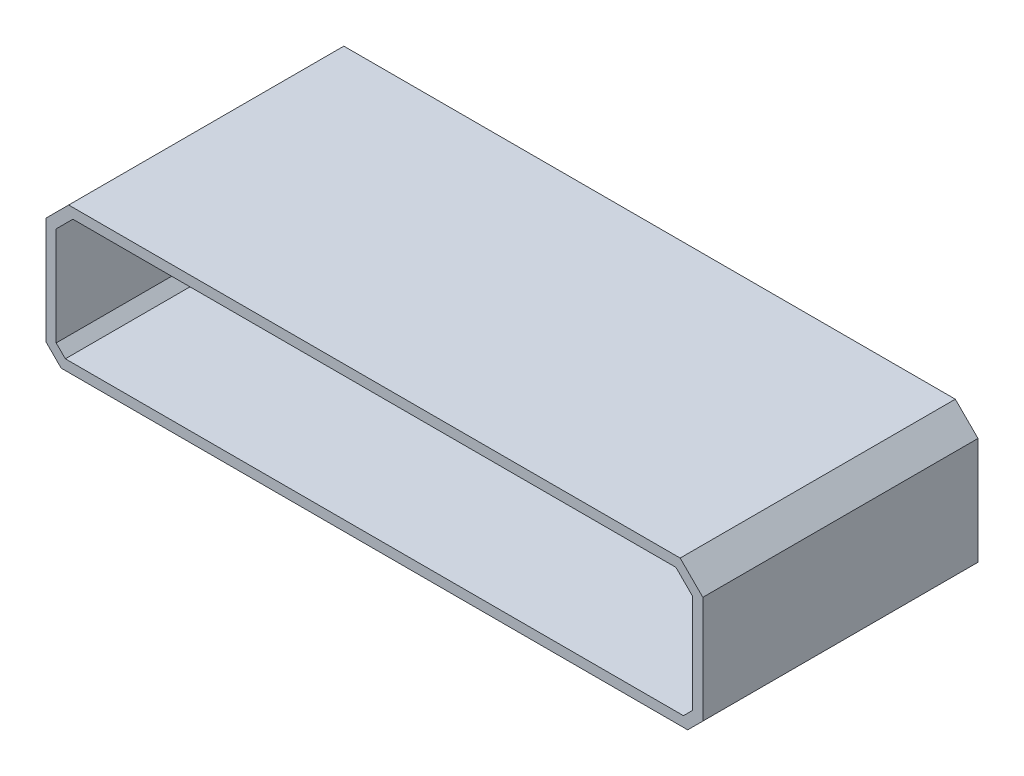
ISO-10303-21;
HEADER;
FILE_DESCRIPTION(('STEP AP214'),'2;1');
FILE_NAME('part.step','',(''),(''),'','','');
FILE_SCHEMA(('AUTOMOTIVE_DESIGN { 1 0 10303 214 1 1 1 1 }'));
ENDSEC;
DATA;
#1=APPLICATION_CONTEXT('core data for automotive mechanical design processes');
#2=APPLICATION_PROTOCOL_DEFINITION('international standard','automotive_design',2000,#1);
#3=PRODUCT_CONTEXT('',#1,'mechanical');
#4=PRODUCT('Part','Part','',(#3));
#5=PRODUCT_RELATED_PRODUCT_CATEGORY('part','',(#4));
#6=PRODUCT_DEFINITION_FORMATION('','',#4);
#7=PRODUCT_DEFINITION_CONTEXT('part definition',#1,'design');
#8=PRODUCT_DEFINITION('design','',#6,#7);
#9=PRODUCT_DEFINITION_SHAPE('','',#8);
#10=(LENGTH_UNIT() NAMED_UNIT(*) SI_UNIT(.MILLI.,.METRE.));
#11=(NAMED_UNIT(*) PLANE_ANGLE_UNIT() SI_UNIT($,.RADIAN.));
#12=(NAMED_UNIT(*) SI_UNIT($,.STERADIAN.) SOLID_ANGLE_UNIT());
#13=UNCERTAINTY_MEASURE_WITH_UNIT(LENGTH_MEASURE(1.E-05),#10,'distance_accuracy_value','');
#14=(GEOMETRIC_REPRESENTATION_CONTEXT(3) GLOBAL_UNCERTAINTY_ASSIGNED_CONTEXT((#13)) GLOBAL_UNIT_ASSIGNED_CONTEXT((#10,
#11,#12)) REPRESENTATION_CONTEXT('',''));
#15=CARTESIAN_POINT('',(0.,0.,0.));
#16=DIRECTION('',(0.,0.,1.));
#17=DIRECTION('',(1.,0.,0.));
#18=AXIS2_PLACEMENT_3D('',#15,#16,#17);
#19=CARTESIAN_POINT('',(0.,0.,685.8));
#20=DIRECTION('',(0.,0.,1.));
#21=DIRECTION('',(1.,0.,0.));
#22=AXIS2_PLACEMENT_3D('',#19,#20,#21);
#23=PLANE('',#22);
#24=DIRECTION('',(-0.707106781186546,-0.707106781186549,0.));
#25=VECTOR('',#24,1.);
#26=CARTESIAN_POINT('',(-762.,0.,685.8));
#27=LINE('',#26,#25);
#28=CARTESIAN_POINT('',(-762.,0.,685.8));
#29=VERTEX_POINT('',#28);
#30=CARTESIAN_POINT('',(-818.489894306675,-56.4898943066749,685.8));
#31=VERTEX_POINT('',#30);
#32=EDGE_CURVE('E215',#29,#31,#27,.T.);
#33=ORIENTED_EDGE('',*,*,#32,.T.);
#34=DIRECTION('',(0.,-1.,0.));
#35=VECTOR('',#34,1.);
#36=CARTESIAN_POINT('',(-818.489894306675,-56.4898943066749,685.8));
#37=LINE('',#36,#35);
#38=CARTESIAN_POINT('',(-818.489894306675,-323.748806026489,685.8));
#39=VERTEX_POINT('',#38);
#40=EDGE_CURVE('E218',#31,#39,#37,.T.);
#41=ORIENTED_EDGE('',*,*,#40,.T.);
#42=DIRECTION('',(0.707106781186548,-0.707106781186547,0.));
#43=VECTOR('',#42,1.);
#44=CARTESIAN_POINT('',(-818.489894306675,-323.748806026489,685.8));
#45=LINE('',#44,#43);
#46=CARTESIAN_POINT('',(-780.750847269863,-361.487853063301,685.8));
#47=VERTEX_POINT('',#46);
#48=EDGE_CURVE('E221',#39,#47,#45,.T.);
#49=ORIENTED_EDGE('',*,*,#48,.T.);
#50=DIRECTION('',(1.,0.,0.));
#51=VECTOR('',#50,1.);
#52=CARTESIAN_POINT('',(-780.750847269863,-361.487853063301,685.8));
#53=LINE('',#52,#51);
#54=CARTESIAN_POINT('',(780.750847269863,-361.487853063301,685.8));
#55=VERTEX_POINT('',#54);
#56=EDGE_CURVE('E223',#47,#55,#53,.T.);
#57=ORIENTED_EDGE('',*,*,#56,.T.);
#58=DIRECTION('',(0.707106781186549,0.707106781186546,0.));
#59=VECTOR('',#58,1.);
#60=CARTESIAN_POINT('',(818.489894306675,-323.748806026489,685.8));
#61=LINE('',#60,#59);
#62=CARTESIAN_POINT('',(818.489894306675,-323.748806026489,685.8));
#63=VERTEX_POINT('',#62);
#64=EDGE_CURVE('E225',#55,#63,#61,.T.);
#65=ORIENTED_EDGE('',*,*,#64,.T.);
#66=DIRECTION('',(0.,1.,0.));
#67=VECTOR('',#66,1.);
#68=CARTESIAN_POINT('',(818.489894306675,-56.4898943066747,685.8));
#69=LINE('',#68,#67);
#70=CARTESIAN_POINT('',(818.489894306675,-56.4898943066747,685.8));
#71=VERTEX_POINT('',#70);
#72=EDGE_CURVE('E227',#63,#71,#69,.T.);
#73=ORIENTED_EDGE('',*,*,#72,.T.);
#74=DIRECTION('',(-0.707106781186546,0.707106781186549,0.));
#75=VECTOR('',#74,1.);
#76=CARTESIAN_POINT('',(762.,2.09200255290344E-13,685.8));
#77=LINE('',#76,#75);
#78=CARTESIAN_POINT('',(762.,2.09200255290344E-13,685.8));
#79=VERTEX_POINT('',#78);
#80=EDGE_CURVE('E229',#71,#79,#77,.T.);
#81=ORIENTED_EDGE('',*,*,#80,.T.);
#82=DIRECTION('',(-1.,0.,0.));
#83=VECTOR('',#82,1.);
#84=CARTESIAN_POINT('',(762.,2.09200255290344E-13,685.8));
#85=LINE('',#84,#83);
#86=EDGE_CURVE('E231',#79,#29,#85,.T.);
#87=ORIENTED_EDGE('',*,*,#86,.T.);
#88=EDGE_LOOP('',(#33,#41,#49,#57,#65,#73,#81,#87));
#89=FACE_BOUND('',#88,.T.);
#90=DIRECTION('',(-1.,0.,0.));
#91=VECTOR('',#90,1.);
#92=CARTESIAN_POINT('',(751.478975515723,-25.3999999999998,685.8));
#93=LINE('',#92,#91);
#94=CARTESIAN_POINT('',(751.478975515723,-25.3999999999998,685.8));
#95=VERTEX_POINT('',#94);
#96=CARTESIAN_POINT('',(-751.478975515723,-25.3999999999998,685.8));
#97=VERTEX_POINT('',#96);
#98=EDGE_CURVE('E158',#95,#97,#93,.T.);
#99=ORIENTED_EDGE('',*,*,#98,.F.);
#100=DIRECTION('',(-0.707106781186547,0.707106781186548,0.));
#101=VECTOR('',#100,1.);
#102=CARTESIAN_POINT('',(751.478975515723,-25.3999999999998,685.8));
#103=LINE('',#102,#101);
#104=CARTESIAN_POINT('',(793.089894306675,-67.0109187909511,685.8));
#105=VERTEX_POINT('',#104);
#106=EDGE_CURVE('E150',#105,#95,#103,.T.);
#107=ORIENTED_EDGE('',*,*,#106,.F.);
#108=DIRECTION('',(0.,1.,0.));
#109=VECTOR('',#108,1.);
#110=CARTESIAN_POINT('',(793.089894306675,-67.0109187909511,685.8));
#111=LINE('',#110,#109);
#112=CARTESIAN_POINT('',(793.089894306675,-313.227781542212,685.8));
#113=VERTEX_POINT('',#112);
#114=EDGE_CURVE('E183',#113,#105,#111,.T.);
#115=ORIENTED_EDGE('',*,*,#114,.F.);
#116=DIRECTION('',(0.707106781186548,0.707106781186547,0.));
#117=VECTOR('',#116,1.);
#118=CARTESIAN_POINT('',(793.089894306675,-313.227781542212,685.8));
#119=LINE('',#118,#117);
#120=CARTESIAN_POINT('',(770.229822785586,-336.087853063301,685.8));
#121=VERTEX_POINT('',#120);
#122=EDGE_CURVE('E181',#121,#113,#119,.T.);
#123=ORIENTED_EDGE('',*,*,#122,.F.);
#124=DIRECTION('',(1.,0.,0.));
#125=VECTOR('',#124,1.);
#126=CARTESIAN_POINT('',(-770.229822785586,-336.087853063301,685.8));
#127=LINE('',#126,#125);
#128=CARTESIAN_POINT('',(-770.229822785586,-336.087853063301,685.8));
#129=VERTEX_POINT('',#128);
#130=EDGE_CURVE('E179',#129,#121,#127,.T.);
#131=ORIENTED_EDGE('',*,*,#130,.F.);
#132=DIRECTION('',(0.707106781186548,-0.707106781186548,0.));
#133=VECTOR('',#132,1.);
#134=CARTESIAN_POINT('',(-793.089894306675,-313.227781542212,685.8));
#135=LINE('',#134,#133);
#136=CARTESIAN_POINT('',(-793.089894306675,-313.227781542212,685.8));
#137=VERTEX_POINT('',#136);
#138=EDGE_CURVE('E177',#137,#129,#135,.T.);
#139=ORIENTED_EDGE('',*,*,#138,.F.);
#140=DIRECTION('',(0.,-1.,0.));
#141=VECTOR('',#140,1.);
#142=CARTESIAN_POINT('',(-793.089894306675,-67.0109187909513,685.8));
#143=LINE('',#142,#141);
#144=CARTESIAN_POINT('',(-793.089894306675,-67.0109187909513,685.8));
#145=VERTEX_POINT('',#144);
#146=EDGE_CURVE('E173',#145,#137,#143,.T.);
#147=ORIENTED_EDGE('',*,*,#146,.F.);
#148=DIRECTION('',(-0.707106781186547,-0.707106781186548,0.));
#149=VECTOR('',#148,1.);
#150=CARTESIAN_POINT('',(-751.478975515723,-25.3999999999998,685.8));
#151=LINE('',#150,#149);
#152=EDGE_CURVE('E171',#97,#145,#151,.T.);
#153=ORIENTED_EDGE('',*,*,#152,.F.);
#154=EDGE_LOOP('',(#99,#107,#115,#123,#131,#139,#147,#153));
#155=FACE_BOUND('',#154,.T.);
#156=ADVANCED_FACE('F37',(#89,#155),#23,.T.);
#157=CARTESIAN_POINT('',(0.,0.,0.));
#158=DIRECTION('',(0.,0.,1.));
#159=DIRECTION('',(1.,0.,0.));
#160=AXIS2_PLACEMENT_3D('',#157,#158,#159);
#161=PLANE('',#160);
#162=DIRECTION('',(-0.707106781186546,-0.707106781186549,0.));
#163=VECTOR('',#162,1.);
#164=CARTESIAN_POINT('',(-762.,0.,0.));
#165=LINE('',#164,#163);
#166=CARTESIAN_POINT('',(-762.,0.,0.));
#167=VERTEX_POINT('',#166);
#168=CARTESIAN_POINT('',(-818.489894306675,-56.4898943066749,0.));
#169=VERTEX_POINT('',#168);
#170=EDGE_CURVE('E166',#167,#169,#165,.T.);
#171=ORIENTED_EDGE('',*,*,#170,.F.);
#172=DIRECTION('',(-1.,0.,0.));
#173=VECTOR('',#172,1.);
#174=CARTESIAN_POINT('',(762.,2.09200255290344E-13,0.));
#175=LINE('',#174,#173);
#176=CARTESIAN_POINT('',(762.,2.09200255290344E-13,0.));
#177=VERTEX_POINT('',#176);
#178=EDGE_CURVE('E219',#177,#167,#175,.T.);
#179=ORIENTED_EDGE('',*,*,#178,.F.);
#180=DIRECTION('',(-0.707106781186546,0.707106781186549,0.));
#181=VECTOR('',#180,1.);
#182=CARTESIAN_POINT('',(762.,2.09200255290344E-13,0.));
#183=LINE('',#182,#181);
#184=CARTESIAN_POINT('',(818.489894306675,-56.4898943066747,0.));
#185=VERTEX_POINT('',#184);
#186=EDGE_CURVE('E246',#185,#177,#183,.T.);
#187=ORIENTED_EDGE('',*,*,#186,.F.);
#188=DIRECTION('',(0.,1.,0.));
#189=VECTOR('',#188,1.);
#190=CARTESIAN_POINT('',(818.489894306675,-56.4898943066747,0.));
#191=LINE('',#190,#189);
#192=CARTESIAN_POINT('',(818.489894306675,-323.748806026489,0.));
#193=VERTEX_POINT('',#192);
#194=EDGE_CURVE('E244',#193,#185,#191,.T.);
#195=ORIENTED_EDGE('',*,*,#194,.F.);
#196=DIRECTION('',(0.707106781186549,0.707106781186546,0.));
#197=VECTOR('',#196,1.);
#198=CARTESIAN_POINT('',(818.489894306675,-323.748806026489,0.));
#199=LINE('',#198,#197);
#200=CARTESIAN_POINT('',(780.750847269863,-361.487853063301,0.));
#201=VERTEX_POINT('',#200);
#202=EDGE_CURVE('E242',#201,#193,#199,.T.);
#203=ORIENTED_EDGE('',*,*,#202,.F.);
#204=DIRECTION('',(1.,0.,0.));
#205=VECTOR('',#204,1.);
#206=CARTESIAN_POINT('',(-780.750847269863,-361.487853063301,0.));
#207=LINE('',#206,#205);
#208=CARTESIAN_POINT('',(-780.750847269863,-361.487853063301,0.));
#209=VERTEX_POINT('',#208);
#210=EDGE_CURVE('E240',#209,#201,#207,.T.);
#211=ORIENTED_EDGE('',*,*,#210,.F.);
#212=DIRECTION('',(0.707106781186548,-0.707106781186547,0.));
#213=VECTOR('',#212,1.);
#214=CARTESIAN_POINT('',(-818.489894306675,-323.748806026489,0.));
#215=LINE('',#214,#213);
#216=CARTESIAN_POINT('',(-818.489894306675,-323.748806026489,0.));
#217=VERTEX_POINT('',#216);
#218=EDGE_CURVE('E238',#217,#209,#215,.T.);
#219=ORIENTED_EDGE('',*,*,#218,.F.);
#220=DIRECTION('',(0.,-1.,0.));
#221=VECTOR('',#220,1.);
#222=CARTESIAN_POINT('',(-818.489894306675,-56.4898943066749,0.));
#223=LINE('',#222,#221);
#224=EDGE_CURVE('E236',#169,#217,#223,.T.);
#225=ORIENTED_EDGE('',*,*,#224,.F.);
#226=EDGE_LOOP('',(#171,#179,#187,#195,#203,#211,#219,#225));
#227=FACE_BOUND('',#226,.T.);
#228=DIRECTION('',(-0.707106781186547,0.707106781186548,0.));
#229=VECTOR('',#228,1.);
#230=CARTESIAN_POINT('',(751.478975515723,-25.3999999999998,0.));
#231=LINE('',#230,#229);
#232=CARTESIAN_POINT('',(793.089894306675,-67.0109187909511,0.));
#233=VERTEX_POINT('',#232);
#234=CARTESIAN_POINT('',(751.478975515723,-25.3999999999998,0.));
#235=VERTEX_POINT('',#234);
#236=EDGE_CURVE('E60',#233,#235,#231,.T.);
#237=ORIENTED_EDGE('',*,*,#236,.T.);
#238=DIRECTION('',(-1.,0.,0.));
#239=VECTOR('',#238,1.);
#240=CARTESIAN_POINT('',(751.478975515723,-25.3999999999998,0.));
#241=LINE('',#240,#239);
#242=CARTESIAN_POINT('',(-751.478975515723,-25.3999999999998,0.));
#243=VERTEX_POINT('',#242);
#244=EDGE_CURVE('E165',#235,#243,#241,.T.);
#245=ORIENTED_EDGE('',*,*,#244,.T.);
#246=DIRECTION('',(-0.707106781186547,-0.707106781186548,0.));
#247=VECTOR('',#246,1.);
#248=CARTESIAN_POINT('',(-751.478975515723,-25.3999999999998,0.));
#249=LINE('',#248,#247);
#250=CARTESIAN_POINT('',(-793.089894306675,-67.0109187909513,0.));
#251=VERTEX_POINT('',#250);
#252=EDGE_CURVE('E187',#243,#251,#249,.T.);
#253=ORIENTED_EDGE('',*,*,#252,.T.);
#254=DIRECTION('',(0.,-1.,0.));
#255=VECTOR('',#254,1.);
#256=CARTESIAN_POINT('',(-793.089894306675,-67.0109187909513,0.));
#257=LINE('',#256,#255);
#258=CARTESIAN_POINT('',(-793.089894306675,-313.227781542212,0.));
#259=VERTEX_POINT('',#258);
#260=EDGE_CURVE('E190',#251,#259,#257,.T.);
#261=ORIENTED_EDGE('',*,*,#260,.T.);
#262=DIRECTION('',(0.707106781186548,-0.707106781186548,0.));
#263=VECTOR('',#262,1.);
#264=CARTESIAN_POINT('',(-793.089894306675,-313.227781542212,0.));
#265=LINE('',#264,#263);
#266=CARTESIAN_POINT('',(-770.229822785586,-336.087853063301,0.));
#267=VERTEX_POINT('',#266);
#268=EDGE_CURVE('E193',#259,#267,#265,.T.);
#269=ORIENTED_EDGE('',*,*,#268,.T.);
#270=DIRECTION('',(1.,0.,0.));
#271=VECTOR('',#270,1.);
#272=CARTESIAN_POINT('',(-770.229822785586,-336.087853063301,0.));
#273=LINE('',#272,#271);
#274=CARTESIAN_POINT('',(770.229822785586,-336.087853063301,0.));
#275=VERTEX_POINT('',#274);
#276=EDGE_CURVE('E196',#267,#275,#273,.T.);
#277=ORIENTED_EDGE('',*,*,#276,.T.);
#278=DIRECTION('',(0.707106781186548,0.707106781186547,0.));
#279=VECTOR('',#278,1.);
#280=CARTESIAN_POINT('',(793.089894306675,-313.227781542212,0.));
#281=LINE('',#280,#279);
#282=CARTESIAN_POINT('',(793.089894306675,-313.227781542212,0.));
#283=VERTEX_POINT('',#282);
#284=EDGE_CURVE('E199',#275,#283,#281,.T.);
#285=ORIENTED_EDGE('',*,*,#284,.T.);
#286=DIRECTION('',(0.,1.,0.));
#287=VECTOR('',#286,1.);
#288=CARTESIAN_POINT('',(793.089894306675,-67.0109187909511,0.));
#289=LINE('',#288,#287);
#290=EDGE_CURVE('E159',#283,#233,#289,.T.);
#291=ORIENTED_EDGE('',*,*,#290,.T.);
#292=EDGE_LOOP('',(#237,#245,#253,#261,#269,#277,#285,#291));
#293=FACE_BOUND('',#292,.T.);
#294=ADVANCED_FACE('F276',(#227,#293),#161,.F.);
#295=CARTESIAN_POINT('',(-762.,0.,685.8));
#296=DIRECTION('',(0.707106781186549,-0.707106781186546,0.));
#297=DIRECTION('',(0.707106781186546,0.707106781186549,0.));
#298=AXIS2_PLACEMENT_3D('',#295,#296,#297);
#299=PLANE('',#298);
#300=ORIENTED_EDGE('',*,*,#170,.T.);
#301=DIRECTION('',(0.,0.,-1.));
#302=VECTOR('',#301,1.);
#303=CARTESIAN_POINT('',(-818.489894306675,-56.4898943066749,685.8));
#304=LINE('',#303,#302);
#305=EDGE_CURVE('E11',#31,#169,#304,.T.);
#306=ORIENTED_EDGE('',*,*,#305,.F.);
#307=ORIENTED_EDGE('',*,*,#32,.F.);
#308=DIRECTION('',(0.,0.,-1.));
#309=VECTOR('',#308,1.);
#310=CARTESIAN_POINT('',(-762.,0.,685.8));
#311=LINE('',#310,#309);
#312=EDGE_CURVE('E233',#29,#167,#311,.T.);
#313=ORIENTED_EDGE('',*,*,#312,.T.);
#314=EDGE_LOOP('',(#300,#306,#307,#313));
#315=FACE_BOUND('',#314,.T.);
#316=ADVANCED_FACE('F39',(#315),#299,.F.);
#317=CARTESIAN_POINT('',(-818.489894306675,-56.4898943066749,685.8));
#318=DIRECTION('',(1.,0.,0.));
#319=DIRECTION('',(0.,0.,-1.));
#320=AXIS2_PLACEMENT_3D('',#317,#318,#319);
#321=PLANE('',#320);
#322=ORIENTED_EDGE('',*,*,#224,.T.);
#323=DIRECTION('',(0.,0.,-1.));
#324=VECTOR('',#323,1.);
#325=CARTESIAN_POINT('',(-818.489894306675,-323.748806026489,685.8));
#326=LINE('',#325,#324);
#327=EDGE_CURVE('E45',#39,#217,#326,.T.);
#328=ORIENTED_EDGE('',*,*,#327,.F.);
#329=ORIENTED_EDGE('',*,*,#40,.F.);
#330=ORIENTED_EDGE('',*,*,#305,.T.);
#331=EDGE_LOOP('',(#322,#328,#329,#330));
#332=FACE_BOUND('',#331,.T.);
#333=ADVANCED_FACE('F293',(#332),#321,.F.);
#334=CARTESIAN_POINT('',(-818.489894306675,-323.748806026489,685.8));
#335=DIRECTION('',(0.707106781186547,0.707106781186548,0.));
#336=DIRECTION('',(-0.707106781186548,0.707106781186547,0.));
#337=AXIS2_PLACEMENT_3D('',#334,#335,#336);
#338=PLANE('',#337);
#339=ORIENTED_EDGE('',*,*,#218,.T.);
#340=DIRECTION('',(0.,0.,-1.));
#341=VECTOR('',#340,1.);
#342=CARTESIAN_POINT('',(-780.750847269863,-361.487853063301,685.8));
#343=LINE('',#342,#341);
#344=EDGE_CURVE('E263',#47,#209,#343,.T.);
#345=ORIENTED_EDGE('',*,*,#344,.F.);
#346=ORIENTED_EDGE('',*,*,#48,.F.);
#347=ORIENTED_EDGE('',*,*,#327,.T.);
#348=EDGE_LOOP('',(#339,#345,#346,#347));
#349=FACE_BOUND('',#348,.T.);
#350=ADVANCED_FACE('F270',(#349),#338,.F.);
#351=CARTESIAN_POINT('',(-780.750847269863,-361.487853063301,685.8));
#352=DIRECTION('',(0.,1.,0.));
#353=DIRECTION('',(-1.,0.,0.));
#354=AXIS2_PLACEMENT_3D('',#351,#352,#353);
#355=PLANE('',#354);
#356=ORIENTED_EDGE('',*,*,#210,.T.);
#357=DIRECTION('',(0.,0.,-1.));
#358=VECTOR('',#357,1.);
#359=CARTESIAN_POINT('',(780.750847269863,-361.487853063301,685.8));
#360=LINE('',#359,#358);
#361=EDGE_CURVE('E260',#55,#201,#360,.T.);
#362=ORIENTED_EDGE('',*,*,#361,.F.);
#363=ORIENTED_EDGE('',*,*,#56,.F.);
#364=ORIENTED_EDGE('',*,*,#344,.T.);
#365=EDGE_LOOP('',(#356,#362,#363,#364));
#366=FACE_BOUND('',#365,.T.);
#367=ADVANCED_FACE('F282',(#366),#355,.F.);
#368=CARTESIAN_POINT('',(818.489894306675,-323.748806026489,685.8));
#369=DIRECTION('',(-0.707106781186546,0.707106781186549,0.));
#370=DIRECTION('',(-0.707106781186549,-0.707106781186546,0.));
#371=AXIS2_PLACEMENT_3D('',#368,#369,#370);
#372=PLANE('',#371);
#373=ORIENTED_EDGE('',*,*,#202,.T.);
#374=DIRECTION('',(0.,0.,-1.));
#375=VECTOR('',#374,1.);
#376=CARTESIAN_POINT('',(818.489894306675,-323.748806026489,685.8));
#377=LINE('',#376,#375);
#378=EDGE_CURVE('E257',#63,#193,#377,.T.);
#379=ORIENTED_EDGE('',*,*,#378,.F.);
#380=ORIENTED_EDGE('',*,*,#64,.F.);
#381=ORIENTED_EDGE('',*,*,#361,.T.);
#382=EDGE_LOOP('',(#373,#379,#380,#381));
#383=FACE_BOUND('',#382,.T.);
#384=ADVANCED_FACE('F286',(#383),#372,.F.);
#385=CARTESIAN_POINT('',(818.489894306675,-56.4898943066747,685.8));
#386=DIRECTION('',(-1.,0.,0.));
#387=DIRECTION('',(0.,-1.,0.));
#388=AXIS2_PLACEMENT_3D('',#385,#386,#387);
#389=PLANE('',#388);
#390=ORIENTED_EDGE('',*,*,#194,.T.);
#391=DIRECTION('',(0.,0.,-1.));
#392=VECTOR('',#391,1.);
#393=CARTESIAN_POINT('',(818.489894306675,-56.4898943066747,685.8));
#394=LINE('',#393,#392);
#395=EDGE_CURVE('E254',#71,#185,#394,.T.);
#396=ORIENTED_EDGE('',*,*,#395,.F.);
#397=ORIENTED_EDGE('',*,*,#72,.F.);
#398=ORIENTED_EDGE('',*,*,#378,.T.);
#399=EDGE_LOOP('',(#390,#396,#397,#398));
#400=FACE_BOUND('',#399,.T.);
#401=ADVANCED_FACE('F306',(#400),#389,.F.);
#402=CARTESIAN_POINT('',(762.,2.09200255290344E-13,685.8));
#403=DIRECTION('',(-0.707106781186549,-0.707106781186546,0.));
#404=DIRECTION('',(0.707106781186546,-0.707106781186549,0.));
#405=AXIS2_PLACEMENT_3D('',#402,#403,#404);
#406=PLANE('',#405);
#407=ORIENTED_EDGE('',*,*,#186,.T.);
#408=DIRECTION('',(0.,0.,-1.));
#409=VECTOR('',#408,1.);
#410=CARTESIAN_POINT('',(762.,2.09200255290344E-13,685.8));
#411=LINE('',#410,#409);
#412=EDGE_CURVE('E251',#79,#177,#411,.T.);
#413=ORIENTED_EDGE('',*,*,#412,.F.);
#414=ORIENTED_EDGE('',*,*,#80,.F.);
#415=ORIENTED_EDGE('',*,*,#395,.T.);
#416=EDGE_LOOP('',(#407,#413,#414,#415));
#417=FACE_BOUND('',#416,.T.);
#418=ADVANCED_FACE('F304',(#417),#406,.F.);
#419=CARTESIAN_POINT('',(762.,2.09200255290344E-13,685.8));
#420=DIRECTION('',(0.,-1.,0.));
#421=DIRECTION('',(1.,0.,0.));
#422=AXIS2_PLACEMENT_3D('',#419,#420,#421);
#423=PLANE('',#422);
#424=ORIENTED_EDGE('',*,*,#178,.T.);
#425=ORIENTED_EDGE('',*,*,#312,.F.);
#426=ORIENTED_EDGE('',*,*,#86,.F.);
#427=ORIENTED_EDGE('',*,*,#412,.T.);
#428=EDGE_LOOP('',(#424,#425,#426,#427));
#429=FACE_BOUND('',#428,.T.);
#430=ADVANCED_FACE('F299',(#429),#423,.F.);
#431=CARTESIAN_POINT('',(751.478975515723,-25.3999999999998,685.8));
#432=DIRECTION('',(-0.707106781186548,-0.707106781186547,0.));
#433=DIRECTION('',(0.707106781186547,-0.707106781186548,0.));
#434=AXIS2_PLACEMENT_3D('',#431,#432,#433);
#435=PLANE('',#434);
#436=ORIENTED_EDGE('',*,*,#236,.F.);
#437=DIRECTION('',(0.,0.,-1.));
#438=VECTOR('',#437,1.);
#439=CARTESIAN_POINT('',(793.089894306675,-67.0109187909511,685.8));
#440=LINE('',#439,#438);
#441=EDGE_CURVE('E154',#105,#233,#440,.T.);
#442=ORIENTED_EDGE('',*,*,#441,.F.);
#443=ORIENTED_EDGE('',*,*,#106,.T.);
#444=DIRECTION('',(0.,0.,-1.));
#445=VECTOR('',#444,1.);
#446=CARTESIAN_POINT('',(751.478975515723,-25.3999999999998,685.8));
#447=LINE('',#446,#445);
#448=EDGE_CURVE('E153',#95,#235,#447,.T.);
#449=ORIENTED_EDGE('',*,*,#448,.T.);
#450=EDGE_LOOP('',(#436,#442,#443,#449));
#451=FACE_BOUND('',#450,.T.);
#452=ADVANCED_FACE('F152',(#451),#435,.T.);
#453=CARTESIAN_POINT('',(751.478975515723,-25.3999999999998,685.8));
#454=DIRECTION('',(0.,-1.,0.));
#455=DIRECTION('',(0.,0.,-1.));
#456=AXIS2_PLACEMENT_3D('',#453,#454,#455);
#457=PLANE('',#456);
#458=ORIENTED_EDGE('',*,*,#244,.F.);
#459=ORIENTED_EDGE('',*,*,#448,.F.);
#460=ORIENTED_EDGE('',*,*,#98,.T.);
#461=DIRECTION('',(0.,0.,-1.));
#462=VECTOR('',#461,1.);
#463=CARTESIAN_POINT('',(-751.478975515723,-25.3999999999998,685.8));
#464=LINE('',#463,#462);
#465=EDGE_CURVE('E167',#97,#243,#464,.T.);
#466=ORIENTED_EDGE('',*,*,#465,.T.);
#467=EDGE_LOOP('',(#458,#459,#460,#466));
#468=FACE_BOUND('',#467,.T.);
#469=ADVANCED_FACE('F162',(#468),#457,.T.);
#470=CARTESIAN_POINT('',(-751.478975515723,-25.3999999999998,685.8));
#471=DIRECTION('',(0.707106781186548,-0.707106781186547,0.));
#472=DIRECTION('',(0.707106781186547,0.707106781186548,0.));
#473=AXIS2_PLACEMENT_3D('',#470,#471,#472);
#474=PLANE('',#473);
#475=ORIENTED_EDGE('',*,*,#252,.F.);
#476=ORIENTED_EDGE('',*,*,#465,.F.);
#477=ORIENTED_EDGE('',*,*,#152,.T.);
#478=DIRECTION('',(0.,0.,-1.));
#479=VECTOR('',#478,1.);
#480=CARTESIAN_POINT('',(-793.089894306675,-67.0109187909513,685.8));
#481=LINE('',#480,#479);
#482=EDGE_CURVE('E212',#145,#251,#481,.T.);
#483=ORIENTED_EDGE('',*,*,#482,.T.);
#484=EDGE_LOOP('',(#475,#476,#477,#483));
#485=FACE_BOUND('',#484,.T.);
#486=ADVANCED_FACE('F331',(#485),#474,.T.);
#487=CARTESIAN_POINT('',(-793.089894306675,-67.0109187909513,685.8));
#488=DIRECTION('',(1.,0.,0.));
#489=DIRECTION('',(0.,0.,-1.));
#490=AXIS2_PLACEMENT_3D('',#487,#488,#489);
#491=PLANE('',#490);
#492=ORIENTED_EDGE('',*,*,#260,.F.);
#493=ORIENTED_EDGE('',*,*,#482,.F.);
#494=ORIENTED_EDGE('',*,*,#146,.T.);
#495=DIRECTION('',(0.,0.,-1.));
#496=VECTOR('',#495,1.);
#497=CARTESIAN_POINT('',(-793.089894306675,-313.227781542212,685.8));
#498=LINE('',#497,#496);
#499=EDGE_CURVE('E210',#137,#259,#498,.T.);
#500=ORIENTED_EDGE('',*,*,#499,.T.);
#501=EDGE_LOOP('',(#492,#493,#494,#500));
#502=FACE_BOUND('',#501,.T.);
#503=ADVANCED_FACE('F335',(#502),#491,.T.);
#504=CARTESIAN_POINT('',(-793.089894306675,-313.227781542212,685.8));
#505=DIRECTION('',(0.707106781186547,0.707106781186547,0.));
#506=DIRECTION('',(-0.707106781186548,0.707106781186548,0.));
#507=AXIS2_PLACEMENT_3D('',#504,#505,#506);
#508=PLANE('',#507);
#509=ORIENTED_EDGE('',*,*,#268,.F.);
#510=ORIENTED_EDGE('',*,*,#499,.F.);
#511=ORIENTED_EDGE('',*,*,#138,.T.);
#512=DIRECTION('',(0.,0.,-1.));
#513=VECTOR('',#512,1.);
#514=CARTESIAN_POINT('',(-770.229822785586,-336.087853063301,685.8));
#515=LINE('',#514,#513);
#516=EDGE_CURVE('E208',#129,#267,#515,.T.);
#517=ORIENTED_EDGE('',*,*,#516,.T.);
#518=EDGE_LOOP('',(#509,#510,#511,#517));
#519=FACE_BOUND('',#518,.T.);
#520=ADVANCED_FACE('F341',(#519),#508,.T.);
#521=CARTESIAN_POINT('',(-770.229822785586,-336.087853063301,685.8));
#522=DIRECTION('',(0.,1.,0.));
#523=DIRECTION('',(0.,0.,1.));
#524=AXIS2_PLACEMENT_3D('',#521,#522,#523);
#525=PLANE('',#524);
#526=ORIENTED_EDGE('',*,*,#276,.F.);
#527=ORIENTED_EDGE('',*,*,#516,.F.);
#528=ORIENTED_EDGE('',*,*,#130,.T.);
#529=DIRECTION('',(0.,0.,-1.));
#530=VECTOR('',#529,1.);
#531=CARTESIAN_POINT('',(770.229822785586,-336.087853063301,685.8));
#532=LINE('',#531,#530);
#533=EDGE_CURVE('E206',#121,#275,#532,.T.);
#534=ORIENTED_EDGE('',*,*,#533,.T.);
#535=EDGE_LOOP('',(#526,#527,#528,#534));
#536=FACE_BOUND('',#535,.T.);
#537=ADVANCED_FACE('F345',(#536),#525,.T.);
#538=CARTESIAN_POINT('',(793.089894306675,-313.227781542212,685.8));
#539=DIRECTION('',(-0.707106781186547,0.707106781186548,0.));
#540=DIRECTION('',(-0.707106781186548,-0.707106781186547,0.));
#541=AXIS2_PLACEMENT_3D('',#538,#539,#540);
#542=PLANE('',#541);
#543=ORIENTED_EDGE('',*,*,#284,.F.);
#544=ORIENTED_EDGE('',*,*,#533,.F.);
#545=ORIENTED_EDGE('',*,*,#122,.T.);
#546=DIRECTION('',(0.,0.,-1.));
#547=VECTOR('',#546,1.);
#548=CARTESIAN_POINT('',(793.089894306675,-313.227781542212,685.8));
#549=LINE('',#548,#547);
#550=EDGE_CURVE('E52',#113,#283,#549,.T.);
#551=ORIENTED_EDGE('',*,*,#550,.T.);
#552=EDGE_LOOP('',(#543,#544,#545,#551));
#553=FACE_BOUND('',#552,.T.);
#554=ADVANCED_FACE('F349',(#553),#542,.T.);
#555=CARTESIAN_POINT('',(793.089894306675,-67.0109187909511,685.8));
#556=DIRECTION('',(-1.,0.,0.));
#557=DIRECTION('',(0.,0.,1.));
#558=AXIS2_PLACEMENT_3D('',#555,#556,#557);
#559=PLANE('',#558);
#560=ORIENTED_EDGE('',*,*,#290,.F.);
#561=ORIENTED_EDGE('',*,*,#550,.F.);
#562=ORIENTED_EDGE('',*,*,#114,.T.);
#563=ORIENTED_EDGE('',*,*,#441,.T.);
#564=EDGE_LOOP('',(#560,#561,#562,#563));
#565=FACE_BOUND('',#564,.T.);
#566=ADVANCED_FACE('F353',(#565),#559,.T.);
#567=CLOSED_SHELL('',(#156,#294,#316,#333,#350,#367,#384,#401,#418,#430,#452,#469,#486,#503,
#520,#537,#554,#566));
#568=MANIFOLD_SOLID_BREP('B2',#567);
#569=ADVANCED_BREP_SHAPE_REPRESENTATION('',(#18,#568),#14);
#570=SHAPE_DEFINITION_REPRESENTATION(#9,#569);
ENDSEC;
END-ISO-10303-21;
